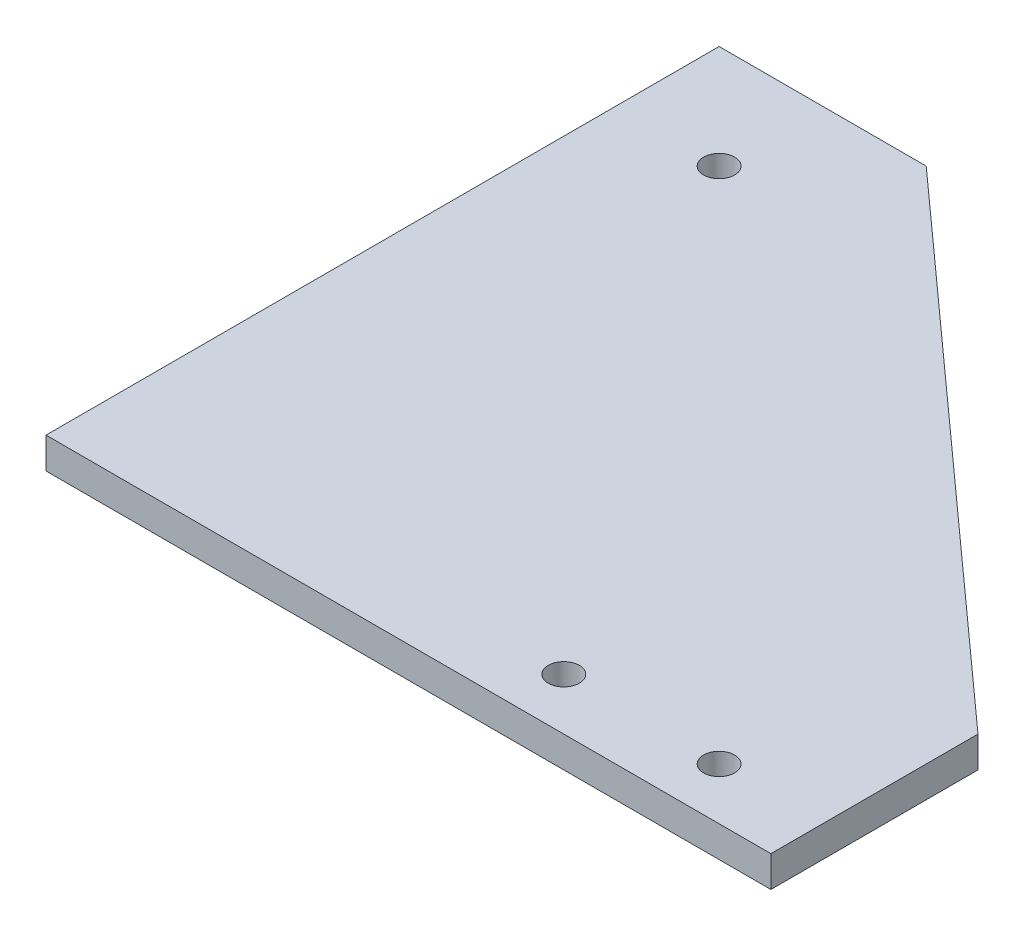
ISO-10303-21;
HEADER;
FILE_DESCRIPTION(('STEP AP214'),'2;1');
FILE_NAME('part.step','',(''),(''),'','','');
FILE_SCHEMA(('AUTOMOTIVE_DESIGN { 1 0 10303 214 1 1 1 1 }'));
ENDSEC;
DATA;
#1=APPLICATION_CONTEXT('core data for automotive mechanical design processes');
#2=APPLICATION_PROTOCOL_DEFINITION('international standard','automotive_design',2000,#1);
#3=PRODUCT_CONTEXT('',#1,'mechanical');
#4=PRODUCT('Part','Part','',(#3));
#5=PRODUCT_RELATED_PRODUCT_CATEGORY('part','',(#4));
#6=PRODUCT_DEFINITION_FORMATION('','',#4);
#7=PRODUCT_DEFINITION_CONTEXT('part definition',#1,'design');
#8=PRODUCT_DEFINITION('design','',#6,#7);
#9=PRODUCT_DEFINITION_SHAPE('','',#8);
#10=(LENGTH_UNIT() NAMED_UNIT(*) SI_UNIT(.MILLI.,.METRE.));
#11=(NAMED_UNIT(*) PLANE_ANGLE_UNIT() SI_UNIT($,.RADIAN.));
#12=(NAMED_UNIT(*) SI_UNIT($,.STERADIAN.) SOLID_ANGLE_UNIT());
#13=UNCERTAINTY_MEASURE_WITH_UNIT(LENGTH_MEASURE(1.E-05),#10,'distance_accuracy_value','');
#14=(GEOMETRIC_REPRESENTATION_CONTEXT(3) GLOBAL_UNCERTAINTY_ASSIGNED_CONTEXT((#13)) GLOBAL_UNIT_ASSIGNED_CONTEXT((#10,
#11,#12)) REPRESENTATION_CONTEXT('',''));
#15=CARTESIAN_POINT('',(0.,0.,0.));
#16=DIRECTION('',(0.,0.,1.));
#17=DIRECTION('',(1.,0.,0.));
#18=AXIS2_PLACEMENT_3D('',#15,#16,#17);
#19=CARTESIAN_POINT('',(-34.420779033009,3.,-31.9621519592226));
#20=DIRECTION('',(0.,1.,0.));
#21=DIRECTION('',(0.,0.,1.));
#22=AXIS2_PLACEMENT_3D('',#19,#20,#21);
#23=PLANE('',#22);
#24=CARTESIAN_POINT('',(-24.420779033009,3.,-21.9621519592226));
#25=DIRECTION('',(0.,1.,0.));
#26=DIRECTION('',(0.,0.,1.));
#27=AXIS2_PLACEMENT_3D('',#24,#25,#26);
#28=CIRCLE('',#27,1.5);
#29=CARTESIAN_POINT('',(-24.420779033009,3.,-20.4621519592226));
#30=VERTEX_POINT('',#29);
#31=EDGE_CURVE('E162',#30,#30,#28,.T.);
#32=ORIENTED_EDGE('',*,*,#31,.F.);
#33=EDGE_LOOP('',(#32));
#34=FACE_BOUND('',#33,.T.);
#35=CARTESIAN_POINT('',(10.579220966991,3.,28.0378480407774));
#36=DIRECTION('',(0.,1.,0.));
#37=DIRECTION('',(0.,0.,1.));
#38=AXIS2_PLACEMENT_3D('',#35,#36,#37);
#39=CIRCLE('',#38,1.5);
#40=CARTESIAN_POINT('',(10.579220966991,3.,29.5378480407774));
#41=VERTEX_POINT('',#40);
#42=EDGE_CURVE('E164',#41,#41,#39,.T.);
#43=ORIENTED_EDGE('',*,*,#42,.F.);
#44=EDGE_LOOP('',(#43));
#45=FACE_BOUND('',#44,.T.);
#46=DIRECTION('',(0.,0.,1.));
#47=VECTOR('',#46,1.);
#48=CARTESIAN_POINT('',(-34.420779033009,3.,33.0378480407774));
#49=LINE('',#48,#47);
#50=CARTESIAN_POINT('',(-34.420779033009,3.,-31.9621519592226));
#51=VERTEX_POINT('',#50);
#52=CARTESIAN_POINT('',(-34.420779033009,3.,33.0378480407774));
#53=VERTEX_POINT('',#52);
#54=EDGE_CURVE('E116',#51,#53,#49,.T.);
#55=ORIENTED_EDGE('',*,*,#54,.T.);
#56=DIRECTION('',(1.,0.,0.));
#57=VECTOR('',#56,1.);
#58=CARTESIAN_POINT('',(35.579220966991,3.,33.0378480407774));
#59=LINE('',#58,#57);
#60=CARTESIAN_POINT('',(35.579220966991,3.,33.0378480407774));
#61=VERTEX_POINT('',#60);
#62=EDGE_CURVE('E83',#53,#61,#59,.T.);
#63=ORIENTED_EDGE('',*,*,#62,.T.);
#64=DIRECTION('',(0.,0.,-1.));
#65=VECTOR('',#64,1.);
#66=CARTESIAN_POINT('',(35.579220966991,3.,33.0378480407774));
#67=LINE('',#66,#65);
#68=CARTESIAN_POINT('',(35.579220966991,3.,13.0378480407774));
#69=VERTEX_POINT('',#68);
#70=EDGE_CURVE('E87',#61,#69,#67,.T.);
#71=ORIENTED_EDGE('',*,*,#70,.T.);
#72=DIRECTION('',(-0.743294146247166,0.,-0.66896473162245));
#73=VECTOR('',#72,1.);
#74=CARTESIAN_POINT('',(-14.420779033009,3.,-31.9621519592226));
#75=LINE('',#74,#73);
#76=CARTESIAN_POINT('',(-14.420779033009,3.,-31.9621519592226));
#77=VERTEX_POINT('',#76);
#78=EDGE_CURVE('E91',#69,#77,#75,.T.);
#79=ORIENTED_EDGE('',*,*,#78,.T.);
#80=DIRECTION('',(-1.,0.,0.));
#81=VECTOR('',#80,1.);
#82=CARTESIAN_POINT('',(-14.420779033009,3.,-31.9621519592226));
#83=LINE('',#82,#81);
#84=EDGE_CURVE('E49',#77,#51,#83,.T.);
#85=ORIENTED_EDGE('',*,*,#84,.T.);
#86=EDGE_LOOP('',(#55,#63,#71,#79,#85));
#87=FACE_BOUND('',#86,.T.);
#88=CARTESIAN_POINT('',(25.579220966991,3.,28.0378480407774));
#89=DIRECTION('',(0.,1.,0.));
#90=DIRECTION('',(0.,0.,1.));
#91=AXIS2_PLACEMENT_3D('',#88,#89,#90);
#92=CIRCLE('',#91,1.5);
#93=CARTESIAN_POINT('',(25.579220966991,3.,29.5378480407774));
#94=VERTEX_POINT('',#93);
#95=EDGE_CURVE('E111',#94,#94,#92,.T.);
#96=ORIENTED_EDGE('',*,*,#95,.F.);
#97=EDGE_LOOP('',(#96));
#98=FACE_BOUND('',#97,.T.);
#99=ADVANCED_FACE('F31',(#34,#45,#87,#98),#23,.T.);
#100=CARTESIAN_POINT('',(-34.420779033009,0.,-31.9621519592226));
#101=DIRECTION('',(0.,1.,0.));
#102=DIRECTION('',(0.,0.,1.));
#103=AXIS2_PLACEMENT_3D('',#100,#101,#102);
#104=PLANE('',#103);
#105=CARTESIAN_POINT('',(-24.420779033009,0.,-21.9621519592226));
#106=DIRECTION('',(0.,1.,0.));
#107=DIRECTION('',(0.,0.,1.));
#108=AXIS2_PLACEMENT_3D('',#105,#106,#107);
#109=CIRCLE('',#108,1.5);
#110=CARTESIAN_POINT('',(-24.420779033009,0.,-20.4621519592226));
#111=VERTEX_POINT('',#110);
#112=EDGE_CURVE('E160',#111,#111,#109,.T.);
#113=ORIENTED_EDGE('',*,*,#112,.T.);
#114=EDGE_LOOP('',(#113));
#115=FACE_BOUND('',#114,.T.);
#116=CARTESIAN_POINT('',(10.579220966991,0.,28.0378480407774));
#117=DIRECTION('',(0.,1.,0.));
#118=DIRECTION('',(0.,0.,1.));
#119=AXIS2_PLACEMENT_3D('',#116,#117,#118);
#120=CIRCLE('',#119,1.5);
#121=CARTESIAN_POINT('',(10.579220966991,0.,29.5378480407774));
#122=VERTEX_POINT('',#121);
#123=EDGE_CURVE('E35',#122,#122,#120,.T.);
#124=ORIENTED_EDGE('',*,*,#123,.T.);
#125=EDGE_LOOP('',(#124));
#126=FACE_BOUND('',#125,.T.);
#127=DIRECTION('',(0.,0.,1.));
#128=VECTOR('',#127,1.);
#129=CARTESIAN_POINT('',(-34.420779033009,0.,33.0378480407774));
#130=LINE('',#129,#128);
#131=CARTESIAN_POINT('',(-34.420779033009,0.,-31.9621519592226));
#132=VERTEX_POINT('',#131);
#133=CARTESIAN_POINT('',(-34.420779033009,0.,33.0378480407774));
#134=VERTEX_POINT('',#133);
#135=EDGE_CURVE('E107',#132,#134,#130,.T.);
#136=ORIENTED_EDGE('',*,*,#135,.F.);
#137=DIRECTION('',(-1.,0.,0.));
#138=VECTOR('',#137,1.);
#139=CARTESIAN_POINT('',(-14.420779033009,0.,-31.9621519592226));
#140=LINE('',#139,#138);
#141=CARTESIAN_POINT('',(-14.420779033009,0.,-31.9621519592226));
#142=VERTEX_POINT('',#141);
#143=EDGE_CURVE('E75',#142,#132,#140,.T.);
#144=ORIENTED_EDGE('',*,*,#143,.F.);
#145=DIRECTION('',(-0.743294146247166,0.,-0.66896473162245));
#146=VECTOR('',#145,1.);
#147=CARTESIAN_POINT('',(-14.420779033009,0.,-31.9621519592226));
#148=LINE('',#147,#146);
#149=CARTESIAN_POINT('',(35.579220966991,0.,13.0378480407774));
#150=VERTEX_POINT('',#149);
#151=EDGE_CURVE('E69',#150,#142,#148,.T.);
#152=ORIENTED_EDGE('',*,*,#151,.F.);
#153=DIRECTION('',(0.,0.,-1.));
#154=VECTOR('',#153,1.);
#155=CARTESIAN_POINT('',(35.579220966991,0.,33.0378480407774));
#156=LINE('',#155,#154);
#157=CARTESIAN_POINT('',(35.579220966991,0.,33.0378480407774));
#158=VERTEX_POINT('',#157);
#159=EDGE_CURVE('E98',#158,#150,#156,.T.);
#160=ORIENTED_EDGE('',*,*,#159,.F.);
#161=DIRECTION('',(1.,0.,0.));
#162=VECTOR('',#161,1.);
#163=CARTESIAN_POINT('',(35.579220966991,0.,33.0378480407774));
#164=LINE('',#163,#162);
#165=EDGE_CURVE('E110',#134,#158,#164,.T.);
#166=ORIENTED_EDGE('',*,*,#165,.F.);
#167=EDGE_LOOP('',(#136,#144,#152,#160,#166));
#168=FACE_BOUND('',#167,.T.);
#169=CARTESIAN_POINT('',(25.579220966991,0.,28.0378480407774));
#170=DIRECTION('',(0.,1.,0.));
#171=DIRECTION('',(0.,0.,1.));
#172=AXIS2_PLACEMENT_3D('',#169,#170,#171);
#173=CIRCLE('',#172,1.5);
#174=CARTESIAN_POINT('',(25.579220966991,0.,29.5378480407774));
#175=VERTEX_POINT('',#174);
#176=EDGE_CURVE('E171',#175,#175,#173,.T.);
#177=ORIENTED_EDGE('',*,*,#176,.T.);
#178=EDGE_LOOP('',(#177));
#179=FACE_BOUND('',#178,.T.);
#180=ADVANCED_FACE('F121',(#115,#126,#168,#179),#104,.F.);
#181=CARTESIAN_POINT('',(-34.420779033009,3.,33.0378480407774));
#182=DIRECTION('',(1.,0.,0.));
#183=DIRECTION('',(0.,0.,-1.));
#184=AXIS2_PLACEMENT_3D('',#181,#182,#183);
#185=PLANE('',#184);
#186=ORIENTED_EDGE('',*,*,#135,.T.);
#187=DIRECTION('',(0.,-1.,0.));
#188=VECTOR('',#187,1.);
#189=CARTESIAN_POINT('',(-34.420779033009,3.,33.0378480407774));
#190=LINE('',#189,#188);
#191=EDGE_CURVE('E11',#53,#134,#190,.T.);
#192=ORIENTED_EDGE('',*,*,#191,.F.);
#193=ORIENTED_EDGE('',*,*,#54,.F.);
#194=DIRECTION('',(0.,-1.,0.));
#195=VECTOR('',#194,1.);
#196=CARTESIAN_POINT('',(-34.420779033009,3.,-31.9621519592226));
#197=LINE('',#196,#195);
#198=EDGE_CURVE('E103',#51,#132,#197,.T.);
#199=ORIENTED_EDGE('',*,*,#198,.T.);
#200=EDGE_LOOP('',(#186,#192,#193,#199));
#201=FACE_BOUND('',#200,.T.);
#202=ADVANCED_FACE('F33',(#201),#185,.F.);
#203=CARTESIAN_POINT('',(35.579220966991,3.,33.0378480407774));
#204=DIRECTION('',(0.,0.,-1.));
#205=DIRECTION('',(-1.,0.,0.));
#206=AXIS2_PLACEMENT_3D('',#203,#204,#205);
#207=PLANE('',#206);
#208=ORIENTED_EDGE('',*,*,#165,.T.);
#209=DIRECTION('',(0.,-1.,0.));
#210=VECTOR('',#209,1.);
#211=CARTESIAN_POINT('',(35.579220966991,3.,33.0378480407774));
#212=LINE('',#211,#210);
#213=EDGE_CURVE('E41',#61,#158,#212,.T.);
#214=ORIENTED_EDGE('',*,*,#213,.F.);
#215=ORIENTED_EDGE('',*,*,#62,.F.);
#216=ORIENTED_EDGE('',*,*,#191,.T.);
#217=EDGE_LOOP('',(#208,#214,#215,#216));
#218=FACE_BOUND('',#217,.T.);
#219=ADVANCED_FACE('F210',(#218),#207,.F.);
#220=CARTESIAN_POINT('',(35.579220966991,3.,33.0378480407774));
#221=DIRECTION('',(-1.,0.,0.));
#222=DIRECTION('',(0.,0.,1.));
#223=AXIS2_PLACEMENT_3D('',#220,#221,#222);
#224=PLANE('',#223);
#225=ORIENTED_EDGE('',*,*,#159,.T.);
#226=DIRECTION('',(0.,-1.,0.));
#227=VECTOR('',#226,1.);
#228=CARTESIAN_POINT('',(35.579220966991,3.,13.0378480407774));
#229=LINE('',#228,#227);
#230=EDGE_CURVE('E95',#69,#150,#229,.T.);
#231=ORIENTED_EDGE('',*,*,#230,.F.);
#232=ORIENTED_EDGE('',*,*,#70,.F.);
#233=ORIENTED_EDGE('',*,*,#213,.T.);
#234=EDGE_LOOP('',(#225,#231,#232,#233));
#235=FACE_BOUND('',#234,.T.);
#236=ADVANCED_FACE('F96',(#235),#224,.F.);
#237=CARTESIAN_POINT('',(-14.420779033009,3.,-31.9621519592226));
#238=DIRECTION('',(-0.66896473162245,0.,0.743294146247166));
#239=DIRECTION('',(0.743294146247166,0.,0.66896473162245));
#240=AXIS2_PLACEMENT_3D('',#237,#238,#239);
#241=PLANE('',#240);
#242=ORIENTED_EDGE('',*,*,#151,.T.);
#243=DIRECTION('',(0.,-1.,0.));
#244=VECTOR('',#243,1.);
#245=CARTESIAN_POINT('',(-14.420779033009,3.,-31.9621519592226));
#246=LINE('',#245,#244);
#247=EDGE_CURVE('E99',#77,#142,#246,.T.);
#248=ORIENTED_EDGE('',*,*,#247,.F.);
#249=ORIENTED_EDGE('',*,*,#78,.F.);
#250=ORIENTED_EDGE('',*,*,#230,.T.);
#251=EDGE_LOOP('',(#242,#248,#249,#250));
#252=FACE_BOUND('',#251,.T.);
#253=ADVANCED_FACE('F101',(#252),#241,.F.);
#254=CARTESIAN_POINT('',(-14.420779033009,3.,-31.9621519592226));
#255=DIRECTION('',(0.,0.,1.));
#256=DIRECTION('',(1.,0.,0.));
#257=AXIS2_PLACEMENT_3D('',#254,#255,#256);
#258=PLANE('',#257);
#259=ORIENTED_EDGE('',*,*,#143,.T.);
#260=ORIENTED_EDGE('',*,*,#198,.F.);
#261=ORIENTED_EDGE('',*,*,#84,.F.);
#262=ORIENTED_EDGE('',*,*,#247,.T.);
#263=EDGE_LOOP('',(#259,#260,#261,#262));
#264=FACE_BOUND('',#263,.T.);
#265=ADVANCED_FACE('F126',(#264),#258,.F.);
#266=CARTESIAN_POINT('',(25.579220966991,3.,28.0378480407774));
#267=DIRECTION('',(0.,-1.,0.));
#268=DIRECTION('',(0.,0.,-1.));
#269=AXIS2_PLACEMENT_3D('',#266,#267,#268);
#270=CYLINDRICAL_SURFACE('',#269,1.5);
#271=ORIENTED_EDGE('',*,*,#95,.T.);
#272=EDGE_LOOP('',(#271));
#273=FACE_BOUND('',#272,.T.);
#274=ORIENTED_EDGE('',*,*,#176,.F.);
#275=EDGE_LOOP('',(#274));
#276=FACE_BOUND('',#275,.T.);
#277=ADVANCED_FACE('F128',(#273,#276),#270,.F.);
#278=CARTESIAN_POINT('',(10.579220966991,-2.,28.0378480407774));
#279=DIRECTION('',(0.,1.,0.));
#280=DIRECTION('',(0.,0.,1.));
#281=AXIS2_PLACEMENT_3D('',#278,#279,#280);
#282=CYLINDRICAL_SURFACE('',#281,1.5);
#283=ORIENTED_EDGE('',*,*,#42,.T.);
#284=EDGE_LOOP('',(#283));
#285=FACE_BOUND('',#284,.T.);
#286=ORIENTED_EDGE('',*,*,#123,.F.);
#287=EDGE_LOOP('',(#286));
#288=FACE_BOUND('',#287,.T.);
#289=ADVANCED_FACE('F134',(#285,#288),#282,.F.);
#290=CARTESIAN_POINT('',(-24.420779033009,0.,-21.9621519592226));
#291=DIRECTION('',(0.,1.,0.));
#292=DIRECTION('',(0.,0.,1.));
#293=AXIS2_PLACEMENT_3D('',#290,#291,#292);
#294=CYLINDRICAL_SURFACE('',#293,1.5);
#295=ORIENTED_EDGE('',*,*,#112,.F.);
#296=EDGE_LOOP('',(#295));
#297=FACE_BOUND('',#296,.T.);
#298=ORIENTED_EDGE('',*,*,#31,.T.);
#299=EDGE_LOOP('',(#298));
#300=FACE_BOUND('',#299,.T.);
#301=ADVANCED_FACE('F151',(#297,#300),#294,.F.);
#302=CLOSED_SHELL('',(#99,#180,#202,#219,#236,#253,#265,#277,#289,#301));
#303=MANIFOLD_SOLID_BREP('B2',#302);
#304=ADVANCED_BREP_SHAPE_REPRESENTATION('',(#18,#303),#14);
#305=SHAPE_DEFINITION_REPRESENTATION(#9,#304);
ENDSEC;
END-ISO-10303-21;
